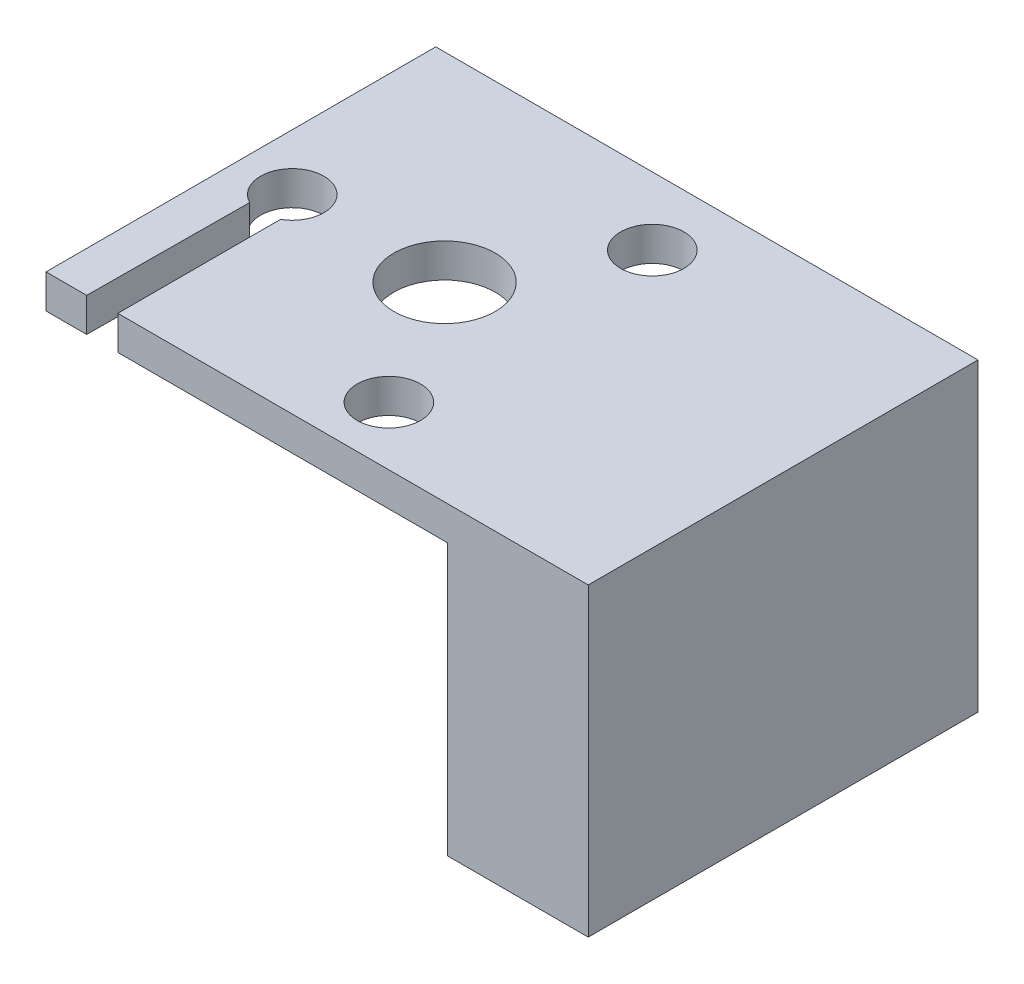
ISO-10303-21;
HEADER;
FILE_DESCRIPTION(('STEP AP214'),'2;1');
FILE_NAME('part.step','',(''),(''),'','','');
FILE_SCHEMA(('AUTOMOTIVE_DESIGN { 1 0 10303 214 1 1 1 1 }'));
ENDSEC;
DATA;
#1=APPLICATION_CONTEXT('core data for automotive mechanical design processes');
#2=APPLICATION_PROTOCOL_DEFINITION('international standard','automotive_design',2000,#1);
#3=PRODUCT_CONTEXT('',#1,'mechanical');
#4=PRODUCT('Part','Part','',(#3));
#5=PRODUCT_RELATED_PRODUCT_CATEGORY('part','',(#4));
#6=PRODUCT_DEFINITION_FORMATION('','',#4);
#7=PRODUCT_DEFINITION_CONTEXT('part definition',#1,'design');
#8=PRODUCT_DEFINITION('design','',#6,#7);
#9=PRODUCT_DEFINITION_SHAPE('','',#8);
#10=(LENGTH_UNIT() NAMED_UNIT(*) SI_UNIT(.MILLI.,.METRE.));
#11=(NAMED_UNIT(*) PLANE_ANGLE_UNIT() SI_UNIT($,.RADIAN.));
#12=(NAMED_UNIT(*) SI_UNIT($,.STERADIAN.) SOLID_ANGLE_UNIT());
#13=UNCERTAINTY_MEASURE_WITH_UNIT(LENGTH_MEASURE(1.E-05),#10,'distance_accuracy_value','');
#14=(GEOMETRIC_REPRESENTATION_CONTEXT(3) GLOBAL_UNCERTAINTY_ASSIGNED_CONTEXT((#13)) GLOBAL_UNIT_ASSIGNED_CONTEXT((#10,
#11,#12)) REPRESENTATION_CONTEXT('',''));
#15=CARTESIAN_POINT('',(0.,0.,0.));
#16=DIRECTION('',(0.,0.,1.));
#17=DIRECTION('',(1.,0.,0.));
#18=AXIS2_PLACEMENT_3D('',#15,#16,#17);
#19=CARTESIAN_POINT('',(-11.1999486642875,0.,-2.11764907787679));
#20=DIRECTION('',(0.,1.,0.));
#21=DIRECTION('',(0.,0.,1.));
#22=AXIS2_PLACEMENT_3D('',#19,#20,#21);
#23=PLANE('',#22);
#24=CARTESIAN_POINT('',(10.1839417283002,0.,10.2105553285309));
#25=DIRECTION('',(0.,1.,0.));
#26=DIRECTION('',(0.,0.,1.));
#27=AXIS2_PLACEMENT_3D('',#24,#25,#26);
#28=CIRCLE('',#27,2.96782810872807);
#29=CARTESIAN_POINT('',(10.1839417283002,0.,13.1783834372589));
#30=VERTEX_POINT('',#29);
#31=EDGE_CURVE('E186',#30,#30,#28,.T.);
#32=ORIENTED_EDGE('',*,*,#31,.T.);
#33=EDGE_LOOP('',(#32));
#34=FACE_BOUND('',#33,.T.);
#35=CARTESIAN_POINT('',(10.1839417282996,0.,-14.4635042192203));
#36=DIRECTION('',(0.,1.,0.));
#37=DIRECTION('',(0.,0.,1.));
#38=AXIS2_PLACEMENT_3D('',#35,#36,#37);
#39=CIRCLE('',#38,2.96782810872807);
#40=CARTESIAN_POINT('',(10.1839417282996,0.,-11.4956761104922));
#41=VERTEX_POINT('',#40);
#42=EDGE_CURVE('E201',#41,#41,#39,.T.);
#43=ORIENTED_EDGE('',*,*,#42,.T.);
#44=EDGE_LOOP('',(#43));
#45=FACE_BOUND('',#44,.T.);
#46=CARTESIAN_POINT('',(3.06115426735215,0.,-2.12647444534419));
#47=DIRECTION('',(0.,1.,0.));
#48=DIRECTION('',(0.,0.,1.));
#49=AXIS2_PLACEMENT_3D('',#46,#47,#48);
#50=CIRCLE('',#49,4.74852497396492);
#51=CARTESIAN_POINT('',(3.06115426735215,0.,2.62205052862072));
#52=VERTEX_POINT('',#51);
#53=EDGE_CURVE('E207',#52,#52,#50,.T.);
#54=ORIENTED_EDGE('',*,*,#53,.T.);
#55=EDGE_LOOP('',(#54));
#56=FACE_BOUND('',#55,.T.);
#57=CARTESIAN_POINT('',(3.06115426735215,0.,-2.12647444534419));
#58=DIRECTION('',(0.,1.,0.));
#59=DIRECTION('',(0.,0.,-1.));
#60=AXIS2_PLACEMENT_3D('',#57,#58,#59);
#61=CIRCLE('',#60,25.4);
#62=CARTESIAN_POINT('',(21.1565475657606,0.,15.6981361079306));
#63=VERTEX_POINT('',#62);
#64=CARTESIAN_POINT('',(20.2635607276989,0.,-20.8143638920694));
#65=VERTEX_POINT('',#64);
#66=EDGE_CURVE('E48',#63,#65,#61,.T.);
#67=ORIENTED_EDGE('',*,*,#66,.F.);
#68=DIRECTION('',(1.,0.,0.));
#69=VECTOR('',#68,1.);
#70=CARTESIAN_POINT('',(-9.72572535707404,0.,15.6981361079306));
#71=LINE('',#70,#69);
#72=CARTESIAN_POINT('',(-9.72572535707404,0.,15.6981361079306));
#73=VERTEX_POINT('',#72);
#74=EDGE_CURVE('E143',#73,#63,#71,.T.);
#75=ORIENTED_EDGE('',*,*,#74,.F.);
#76=DIRECTION('',(0.,0.,1.));
#77=VECTOR('',#76,1.);
#78=CARTESIAN_POINT('',(-9.72572535707404,0.,15.6981361079306));
#79=LINE('',#78,#77);
#80=CARTESIAN_POINT('',(-9.72572535707404,0.,0.45813610793064));
#81=VERTEX_POINT('',#80);
#82=EDGE_CURVE('E140',#81,#73,#79,.T.);
#83=ORIENTED_EDGE('',*,*,#82,.F.);
#84=CARTESIAN_POINT('',(-11.1999486642875,0.,-2.11764907787679));
#85=DIRECTION('',(0.,-1.,0.));
#86=DIRECTION('',(0.,0.,1.));
#87=AXIS2_PLACEMENT_3D('',#84,#85,#86);
#88=CIRCLE('',#87,2.96782810872808);
#89=CARTESIAN_POINT('',(-12.5354122028235,0.,0.532735954566142));
#90=VERTEX_POINT('',#89);
#91=EDGE_CURVE('E137',#90,#81,#88,.T.);
#92=ORIENTED_EDGE('',*,*,#91,.F.);
#93=DIRECTION('',(0.00698126029795429,0.,-0.999975630705395));
#94=VECTOR('',#93,1.);
#95=CARTESIAN_POINT('',(-12.5354122028235,0.,0.532735954566142));
#96=LINE('',#95,#94);
#97=CARTESIAN_POINT('',(-12.6412883889447,0.,15.6981361079306));
#98=VERTEX_POINT('',#97);
#99=EDGE_CURVE('E84',#98,#90,#96,.T.);
#100=ORIENTED_EDGE('',*,*,#99,.F.);
#101=DIRECTION('',(1.,0.,0.));
#102=VECTOR('',#101,1.);
#103=CARTESIAN_POINT('',(-16.4512883889447,0.,15.6981361079306));
#104=LINE('',#103,#102);
#105=CARTESIAN_POINT('',(-16.4512883889447,0.,15.6981361079306));
#106=VERTEX_POINT('',#105);
#107=EDGE_CURVE('E148',#106,#98,#104,.T.);
#108=ORIENTED_EDGE('',*,*,#107,.F.);
#109=DIRECTION('',(0.,0.,1.));
#110=VECTOR('',#109,1.);
#111=CARTESIAN_POINT('',(-16.4512883889447,0.,-20.8143638920694));
#112=LINE('',#111,#110);
#113=CARTESIAN_POINT('',(-16.4512883889447,0.,-20.8143638920694));
#114=VERTEX_POINT('',#113);
#115=EDGE_CURVE('E125',#114,#106,#112,.T.);
#116=ORIENTED_EDGE('',*,*,#115,.F.);
#117=DIRECTION('',(-1.,0.,0.));
#118=VECTOR('',#117,1.);
#119=CARTESIAN_POINT('',(34.3487116110553,0.,-20.8143638920694));
#120=LINE('',#119,#118);
#121=EDGE_CURVE('E145',#65,#114,#120,.T.);
#122=ORIENTED_EDGE('',*,*,#121,.F.);
#123=EDGE_LOOP('',(#67,#75,#83,#92,#100,#108,#116,#122));
#124=FACE_BOUND('',#123,.T.);
#125=ADVANCED_FACE('F33',(#34,#45,#56,#124),#23,.F.);
#126=CARTESIAN_POINT('',(-11.1999486642875,3.175,-2.11764907787679));
#127=DIRECTION('',(0.,1.,0.));
#128=DIRECTION('',(0.,0.,1.));
#129=AXIS2_PLACEMENT_3D('',#126,#127,#128);
#130=PLANE('',#129);
#131=CARTESIAN_POINT('',(10.1839417282996,3.175,-14.4635042192203));
#132=DIRECTION('',(0.,1.,0.));
#133=DIRECTION('',(0.,0.,1.));
#134=AXIS2_PLACEMENT_3D('',#131,#132,#133);
#135=CIRCLE('',#134,2.96782810872807);
#136=CARTESIAN_POINT('',(10.1839417282996,3.175,-11.4956761104922));
#137=VERTEX_POINT('',#136);
#138=EDGE_CURVE('E204',#137,#137,#135,.T.);
#139=ORIENTED_EDGE('',*,*,#138,.F.);
#140=EDGE_LOOP('',(#139));
#141=FACE_BOUND('',#140,.T.);
#142=CARTESIAN_POINT('',(-11.1999486642875,3.175,-2.11764907787679));
#143=DIRECTION('',(0.,-1.,0.));
#144=DIRECTION('',(0.,0.,1.));
#145=AXIS2_PLACEMENT_3D('',#142,#143,#144);
#146=CIRCLE('',#145,2.96782810872808);
#147=CARTESIAN_POINT('',(-12.5354122028235,3.175,0.532735954566142));
#148=VERTEX_POINT('',#147);
#149=CARTESIAN_POINT('',(-9.72572535707404,3.175,0.45813610793064));
#150=VERTEX_POINT('',#149);
#151=EDGE_CURVE('E151',#148,#150,#146,.T.);
#152=ORIENTED_EDGE('',*,*,#151,.T.);
#153=DIRECTION('',(0.,0.,1.));
#154=VECTOR('',#153,1.);
#155=CARTESIAN_POINT('',(-9.72572535707404,3.175,15.6981361079306));
#156=LINE('',#155,#154);
#157=CARTESIAN_POINT('',(-9.72572535707404,3.175,15.6981361079306));
#158=VERTEX_POINT('',#157);
#159=EDGE_CURVE('E92',#150,#158,#156,.T.);
#160=ORIENTED_EDGE('',*,*,#159,.T.);
#161=DIRECTION('',(1.,0.,0.));
#162=VECTOR('',#161,1.);
#163=CARTESIAN_POINT('',(-9.72572535707404,3.175,15.6981361079306));
#164=LINE('',#163,#162);
#165=CARTESIAN_POINT('',(34.3487116110553,3.175,15.6981361079306));
#166=VERTEX_POINT('',#165);
#167=EDGE_CURVE('E167',#158,#166,#164,.T.);
#168=ORIENTED_EDGE('',*,*,#167,.T.);
#169=DIRECTION('',(0.,0.,-1.));
#170=VECTOR('',#169,1.);
#171=CARTESIAN_POINT('',(34.3487116110553,3.175,15.6981361079306));
#172=LINE('',#171,#170);
#173=CARTESIAN_POINT('',(34.3487116110553,3.175,-20.8143638920694));
#174=VERTEX_POINT('',#173);
#175=EDGE_CURVE('E217',#166,#174,#172,.T.);
#176=ORIENTED_EDGE('',*,*,#175,.T.);
#177=DIRECTION('',(-1.,0.,0.));
#178=VECTOR('',#177,1.);
#179=CARTESIAN_POINT('',(34.3487116110553,3.175,-20.8143638920694));
#180=LINE('',#179,#178);
#181=CARTESIAN_POINT('',(-16.4512883889447,3.175,-20.8143638920694));
#182=VERTEX_POINT('',#181);
#183=EDGE_CURVE('E116',#174,#182,#180,.T.);
#184=ORIENTED_EDGE('',*,*,#183,.T.);
#185=DIRECTION('',(0.,0.,1.));
#186=VECTOR('',#185,1.);
#187=CARTESIAN_POINT('',(-16.4512883889447,3.175,-20.8143638920694));
#188=LINE('',#187,#186);
#189=CARTESIAN_POINT('',(-16.4512883889447,3.175,15.6981361079306));
#190=VERTEX_POINT('',#189);
#191=EDGE_CURVE('E108',#182,#190,#188,.T.);
#192=ORIENTED_EDGE('',*,*,#191,.T.);
#193=DIRECTION('',(1.,0.,0.));
#194=VECTOR('',#193,1.);
#195=CARTESIAN_POINT('',(-16.4512883889447,3.175,15.6981361079306));
#196=LINE('',#195,#194);
#197=CARTESIAN_POINT('',(-12.6412883889447,3.175,15.6981361079306));
#198=VERTEX_POINT('',#197);
#199=EDGE_CURVE('E113',#190,#198,#196,.T.);
#200=ORIENTED_EDGE('',*,*,#199,.T.);
#201=DIRECTION('',(0.00698126029795429,0.,-0.999975630705395));
#202=VECTOR('',#201,1.);
#203=CARTESIAN_POINT('',(-12.5354122028235,3.175,0.532735954566142));
#204=LINE('',#203,#202);
#205=EDGE_CURVE('E57',#198,#148,#204,.T.);
#206=ORIENTED_EDGE('',*,*,#205,.T.);
#207=EDGE_LOOP('',(#152,#160,#168,#176,#184,#192,#200,#206));
#208=FACE_BOUND('',#207,.T.);
#209=CARTESIAN_POINT('',(3.06115426735215,3.175,-2.12647444534419));
#210=DIRECTION('',(0.,1.,0.));
#211=DIRECTION('',(0.,0.,1.));
#212=AXIS2_PLACEMENT_3D('',#209,#210,#211);
#213=CIRCLE('',#212,4.74852497396492);
#214=CARTESIAN_POINT('',(3.06115426735215,3.175,2.62205052862072));
#215=VERTEX_POINT('',#214);
#216=EDGE_CURVE('E141',#215,#215,#213,.T.);
#217=ORIENTED_EDGE('',*,*,#216,.F.);
#218=EDGE_LOOP('',(#217));
#219=FACE_BOUND('',#218,.T.);
#220=CARTESIAN_POINT('',(10.1839417283002,3.175,10.2105553285309));
#221=DIRECTION('',(0.,1.,0.));
#222=DIRECTION('',(0.,0.,1.));
#223=AXIS2_PLACEMENT_3D('',#220,#221,#222);
#224=CIRCLE('',#223,2.96782810872807);
#225=CARTESIAN_POINT('',(10.1839417283002,3.175,13.1783834372589));
#226=VERTEX_POINT('',#225);
#227=EDGE_CURVE('E198',#226,#226,#224,.T.);
#228=ORIENTED_EDGE('',*,*,#227,.F.);
#229=EDGE_LOOP('',(#228));
#230=FACE_BOUND('',#229,.T.);
#231=ADVANCED_FACE('F110',(#141,#208,#219,#230),#130,.T.);
#232=CARTESIAN_POINT('',(-11.1999486642875,3.175,-2.11764907787679));
#233=DIRECTION('',(0.,-1.,0.));
#234=DIRECTION('',(0.,0.,-1.));
#235=AXIS2_PLACEMENT_3D('',#232,#233,#234);
#236=CYLINDRICAL_SURFACE('',#235,2.96782810872808);
#237=ORIENTED_EDGE('',*,*,#91,.T.);
#238=DIRECTION('',(0.,-1.,0.));
#239=VECTOR('',#238,1.);
#240=CARTESIAN_POINT('',(-9.72572535707404,3.175,0.45813610793064));
#241=LINE('',#240,#239);
#242=EDGE_CURVE('E11',#150,#81,#241,.T.);
#243=ORIENTED_EDGE('',*,*,#242,.F.);
#244=ORIENTED_EDGE('',*,*,#151,.F.);
#245=DIRECTION('',(0.,-1.,0.));
#246=VECTOR('',#245,1.);
#247=CARTESIAN_POINT('',(-12.5354122028235,3.175,0.532735954566142));
#248=LINE('',#247,#246);
#249=EDGE_CURVE('E133',#148,#90,#248,.T.);
#250=ORIENTED_EDGE('',*,*,#249,.T.);
#251=EDGE_LOOP('',(#237,#243,#244,#250));
#252=FACE_BOUND('',#251,.T.);
#253=ADVANCED_FACE('F35',(#252),#236,.F.);
#254=CARTESIAN_POINT('',(-9.72572535707404,3.175,15.6981361079306));
#255=DIRECTION('',(1.,0.,0.));
#256=DIRECTION('',(0.,0.,-1.));
#257=AXIS2_PLACEMENT_3D('',#254,#255,#256);
#258=PLANE('',#257);
#259=ORIENTED_EDGE('',*,*,#82,.T.);
#260=DIRECTION('',(0.,-1.,0.));
#261=VECTOR('',#260,1.);
#262=CARTESIAN_POINT('',(-9.72572535707404,3.175,15.6981361079306));
#263=LINE('',#262,#261);
#264=EDGE_CURVE('E41',#158,#73,#263,.T.);
#265=ORIENTED_EDGE('',*,*,#264,.F.);
#266=ORIENTED_EDGE('',*,*,#159,.F.);
#267=ORIENTED_EDGE('',*,*,#242,.T.);
#268=EDGE_LOOP('',(#259,#265,#266,#267));
#269=FACE_BOUND('',#268,.T.);
#270=ADVANCED_FACE('F170',(#269),#258,.F.);
#271=CARTESIAN_POINT('',(-9.72572535707404,3.175,15.6981361079306));
#272=DIRECTION('',(0.,0.,-1.));
#273=DIRECTION('',(-1.,0.,0.));
#274=AXIS2_PLACEMENT_3D('',#271,#272,#273);
#275=PLANE('',#274);
#276=ORIENTED_EDGE('',*,*,#74,.T.);
#277=DIRECTION('',(0.,1.,0.));
#278=VECTOR('',#277,1.);
#279=CARTESIAN_POINT('',(21.1565475657606,-25.4,15.6981361079306));
#280=LINE('',#279,#278);
#281=CARTESIAN_POINT('',(21.1565475657606,-25.4,15.6981361079306));
#282=VERTEX_POINT('',#281);
#283=EDGE_CURVE('E187',#282,#63,#280,.T.);
#284=ORIENTED_EDGE('',*,*,#283,.F.);
#285=DIRECTION('',(-1.,0.,0.));
#286=VECTOR('',#285,1.);
#287=CARTESIAN_POINT('',(34.3487116110553,-25.4,15.6981361079306));
#288=LINE('',#287,#286);
#289=CARTESIAN_POINT('',(34.3487116110553,-25.4,15.6981361079306));
#290=VERTEX_POINT('',#289);
#291=EDGE_CURVE('E195',#290,#282,#288,.T.);
#292=ORIENTED_EDGE('',*,*,#291,.F.);
#293=DIRECTION('',(0.,-1.,0.));
#294=VECTOR('',#293,1.);
#295=CARTESIAN_POINT('',(34.3487116110553,3.175,15.6981361079306));
#296=LINE('',#295,#294);
#297=EDGE_CURVE('E158',#166,#290,#296,.T.);
#298=ORIENTED_EDGE('',*,*,#297,.F.);
#299=ORIENTED_EDGE('',*,*,#167,.F.);
#300=ORIENTED_EDGE('',*,*,#264,.T.);
#301=EDGE_LOOP('',(#276,#284,#292,#298,#299,#300));
#302=FACE_BOUND('',#301,.T.);
#303=ADVANCED_FACE('F163',(#302),#275,.F.);
#304=CARTESIAN_POINT('',(34.3487116110553,3.175,15.6981361079306));
#305=DIRECTION('',(-1.,0.,0.));
#306=DIRECTION('',(0.,0.,1.));
#307=AXIS2_PLACEMENT_3D('',#304,#305,#306);
#308=PLANE('',#307);
#309=ORIENTED_EDGE('',*,*,#297,.T.);
#310=DIRECTION('',(0.,0.,1.));
#311=VECTOR('',#310,1.);
#312=CARTESIAN_POINT('',(34.3487116110553,-25.4,-20.8143638920694));
#313=LINE('',#312,#311);
#314=CARTESIAN_POINT('',(34.3487116110553,-25.4,-20.8143638920694));
#315=VERTEX_POINT('',#314);
#316=EDGE_CURVE('E225',#315,#290,#313,.T.);
#317=ORIENTED_EDGE('',*,*,#316,.F.);
#318=DIRECTION('',(0.,-1.,0.));
#319=VECTOR('',#318,1.);
#320=CARTESIAN_POINT('',(34.3487116110553,3.175,-20.8143638920694));
#321=LINE('',#320,#319);
#322=EDGE_CURVE('E155',#174,#315,#321,.T.);
#323=ORIENTED_EDGE('',*,*,#322,.F.);
#324=ORIENTED_EDGE('',*,*,#175,.F.);
#325=EDGE_LOOP('',(#309,#317,#323,#324));
#326=FACE_BOUND('',#325,.T.);
#327=ADVANCED_FACE('F222',(#326),#308,.F.);
#328=CARTESIAN_POINT('',(34.3487116110553,3.175,-20.8143638920694));
#329=DIRECTION('',(0.,0.,1.));
#330=DIRECTION('',(1.,0.,0.));
#331=AXIS2_PLACEMENT_3D('',#328,#329,#330);
#332=PLANE('',#331);
#333=ORIENTED_EDGE('',*,*,#322,.T.);
#334=DIRECTION('',(1.,0.,0.));
#335=VECTOR('',#334,1.);
#336=CARTESIAN_POINT('',(20.2635607276989,-25.4,-20.8143638920694));
#337=LINE('',#336,#335);
#338=CARTESIAN_POINT('',(20.2635607276989,-25.4,-20.8143638920694));
#339=VERTEX_POINT('',#338);
#340=EDGE_CURVE('E182',#339,#315,#337,.T.);
#341=ORIENTED_EDGE('',*,*,#340,.F.);
#342=DIRECTION('',(0.,1.,0.));
#343=VECTOR('',#342,1.);
#344=CARTESIAN_POINT('',(20.2635607276989,-25.4,-20.8143638920694));
#345=LINE('',#344,#343);
#346=EDGE_CURVE('E179',#339,#65,#345,.T.);
#347=ORIENTED_EDGE('',*,*,#346,.T.);
#348=ORIENTED_EDGE('',*,*,#121,.T.);
#349=DIRECTION('',(0.,-1.,0.));
#350=VECTOR('',#349,1.);
#351=CARTESIAN_POINT('',(-16.4512883889447,3.175,-20.8143638920694));
#352=LINE('',#351,#350);
#353=EDGE_CURVE('E128',#182,#114,#352,.T.);
#354=ORIENTED_EDGE('',*,*,#353,.F.);
#355=ORIENTED_EDGE('',*,*,#183,.F.);
#356=EDGE_LOOP('',(#333,#341,#347,#348,#354,#355));
#357=FACE_BOUND('',#356,.T.);
#358=ADVANCED_FACE('F180',(#357),#332,.F.);
#359=CARTESIAN_POINT('',(-16.4512883889447,3.175,-20.8143638920694));
#360=DIRECTION('',(1.,0.,0.));
#361=DIRECTION('',(0.,0.,-1.));
#362=AXIS2_PLACEMENT_3D('',#359,#360,#361);
#363=PLANE('',#362);
#364=ORIENTED_EDGE('',*,*,#115,.T.);
#365=DIRECTION('',(0.,-1.,0.));
#366=VECTOR('',#365,1.);
#367=CARTESIAN_POINT('',(-16.4512883889447,3.175,15.6981361079306));
#368=LINE('',#367,#366);
#369=EDGE_CURVE('E122',#190,#106,#368,.T.);
#370=ORIENTED_EDGE('',*,*,#369,.F.);
#371=ORIENTED_EDGE('',*,*,#191,.F.);
#372=ORIENTED_EDGE('',*,*,#353,.T.);
#373=EDGE_LOOP('',(#364,#370,#371,#372));
#374=FACE_BOUND('',#373,.T.);
#375=ADVANCED_FACE('F123',(#374),#363,.F.);
#376=CARTESIAN_POINT('',(-16.4512883889447,3.175,15.6981361079306));
#377=DIRECTION('',(0.,0.,-1.));
#378=DIRECTION('',(-1.,0.,0.));
#379=AXIS2_PLACEMENT_3D('',#376,#377,#378);
#380=PLANE('',#379);
#381=ORIENTED_EDGE('',*,*,#107,.T.);
#382=DIRECTION('',(0.,-1.,0.));
#383=VECTOR('',#382,1.);
#384=CARTESIAN_POINT('',(-12.6412883889447,3.175,15.6981361079306));
#385=LINE('',#384,#383);
#386=EDGE_CURVE('E129',#198,#98,#385,.T.);
#387=ORIENTED_EDGE('',*,*,#386,.F.);
#388=ORIENTED_EDGE('',*,*,#199,.F.);
#389=ORIENTED_EDGE('',*,*,#369,.T.);
#390=EDGE_LOOP('',(#381,#387,#388,#389));
#391=FACE_BOUND('',#390,.T.);
#392=ADVANCED_FACE('F131',(#391),#380,.F.);
#393=CARTESIAN_POINT('',(-12.5354122028235,3.175,0.532735954566142));
#394=DIRECTION('',(-0.999975630705395,0.,-0.00698126029795429));
#395=DIRECTION('',(-0.00698126029795429,0.,0.999975630705395));
#396=AXIS2_PLACEMENT_3D('',#393,#394,#395);
#397=PLANE('',#396);
#398=ORIENTED_EDGE('',*,*,#99,.T.);
#399=ORIENTED_EDGE('',*,*,#249,.F.);
#400=ORIENTED_EDGE('',*,*,#205,.F.);
#401=ORIENTED_EDGE('',*,*,#386,.T.);
#402=EDGE_LOOP('',(#398,#399,#400,#401));
#403=FACE_BOUND('',#402,.T.);
#404=ADVANCED_FACE('F173',(#403),#397,.F.);
#405=CARTESIAN_POINT('',(3.06115426735215,3.175,-2.12647444534419));
#406=DIRECTION('',(0.,-1.,0.));
#407=DIRECTION('',(0.,0.,-1.));
#408=AXIS2_PLACEMENT_3D('',#405,#406,#407);
#409=CYLINDRICAL_SURFACE('',#408,4.74852497396492);
#410=ORIENTED_EDGE('',*,*,#216,.T.);
#411=EDGE_LOOP('',(#410));
#412=FACE_BOUND('',#411,.T.);
#413=ORIENTED_EDGE('',*,*,#53,.F.);
#414=EDGE_LOOP('',(#413));
#415=FACE_BOUND('',#414,.T.);
#416=ADVANCED_FACE('F255',(#412,#415),#409,.F.);
#417=CARTESIAN_POINT('',(10.1839417282996,3.175,-14.4635042192203));
#418=DIRECTION('',(0.,-1.,0.));
#419=DIRECTION('',(0.,0.,-1.));
#420=AXIS2_PLACEMENT_3D('',#417,#418,#419);
#421=CYLINDRICAL_SURFACE('',#420,2.96782810872807);
#422=ORIENTED_EDGE('',*,*,#138,.T.);
#423=EDGE_LOOP('',(#422));
#424=FACE_BOUND('',#423,.T.);
#425=ORIENTED_EDGE('',*,*,#42,.F.);
#426=EDGE_LOOP('',(#425));
#427=FACE_BOUND('',#426,.T.);
#428=ADVANCED_FACE('F329',(#424,#427),#421,.F.);
#429=CARTESIAN_POINT('',(10.1839417283002,3.175,10.2105553285309));
#430=DIRECTION('',(0.,-1.,0.));
#431=DIRECTION('',(0.,0.,-1.));
#432=AXIS2_PLACEMENT_3D('',#429,#430,#431);
#433=CYLINDRICAL_SURFACE('',#432,2.96782810872807);
#434=ORIENTED_EDGE('',*,*,#227,.T.);
#435=EDGE_LOOP('',(#434));
#436=FACE_BOUND('',#435,.T.);
#437=ORIENTED_EDGE('',*,*,#31,.F.);
#438=EDGE_LOOP('',(#437));
#439=FACE_BOUND('',#438,.T.);
#440=ADVANCED_FACE('F240',(#436,#439),#433,.F.);
#441=CARTESIAN_POINT('',(3.06115426735215,-25.4,-2.12647444534419));
#442=DIRECTION('',(0.,1.,0.));
#443=DIRECTION('',(0.,0.,1.));
#444=AXIS2_PLACEMENT_3D('',#441,#442,#443);
#445=CYLINDRICAL_SURFACE('',#444,25.4);
#446=ORIENTED_EDGE('',*,*,#66,.T.);
#447=ORIENTED_EDGE('',*,*,#346,.F.);
#448=CARTESIAN_POINT('',(3.06115426735215,-25.4,-2.12647444534419));
#449=DIRECTION('',(0.,1.,0.));
#450=DIRECTION('',(0.,0.,-1.));
#451=AXIS2_PLACEMENT_3D('',#448,#449,#450);
#452=CIRCLE('',#451,25.4);
#453=EDGE_CURVE('E190',#282,#339,#452,.T.);
#454=ORIENTED_EDGE('',*,*,#453,.F.);
#455=ORIENTED_EDGE('',*,*,#283,.T.);
#456=EDGE_LOOP('',(#446,#447,#454,#455));
#457=FACE_BOUND('',#456,.T.);
#458=ADVANCED_FACE('F189',(#457),#445,.F.);
#459=CARTESIAN_POINT('',(3.06115426735215,-25.4,-2.12647444534419));
#460=DIRECTION('',(0.,-1.,0.));
#461=DIRECTION('',(0.,0.,-1.));
#462=AXIS2_PLACEMENT_3D('',#459,#460,#461);
#463=PLANE('',#462);
#464=ORIENTED_EDGE('',*,*,#453,.T.);
#465=ORIENTED_EDGE('',*,*,#340,.T.);
#466=ORIENTED_EDGE('',*,*,#316,.T.);
#467=ORIENTED_EDGE('',*,*,#291,.T.);
#468=EDGE_LOOP('',(#464,#465,#466,#467));
#469=FACE_BOUND('',#468,.T.);
#470=ADVANCED_FACE('F229',(#469),#463,.T.);
#471=CLOSED_SHELL('',(#125,#231,#253,#270,#303,#327,#358,#375,#392,#404,#416,#428,#440,#458,#470));
#472=MANIFOLD_SOLID_BREP('B2',#471);
#473=ADVANCED_BREP_SHAPE_REPRESENTATION('',(#18,#472),#14);
#474=SHAPE_DEFINITION_REPRESENTATION(#9,#473);
ENDSEC;
END-ISO-10303-21;
